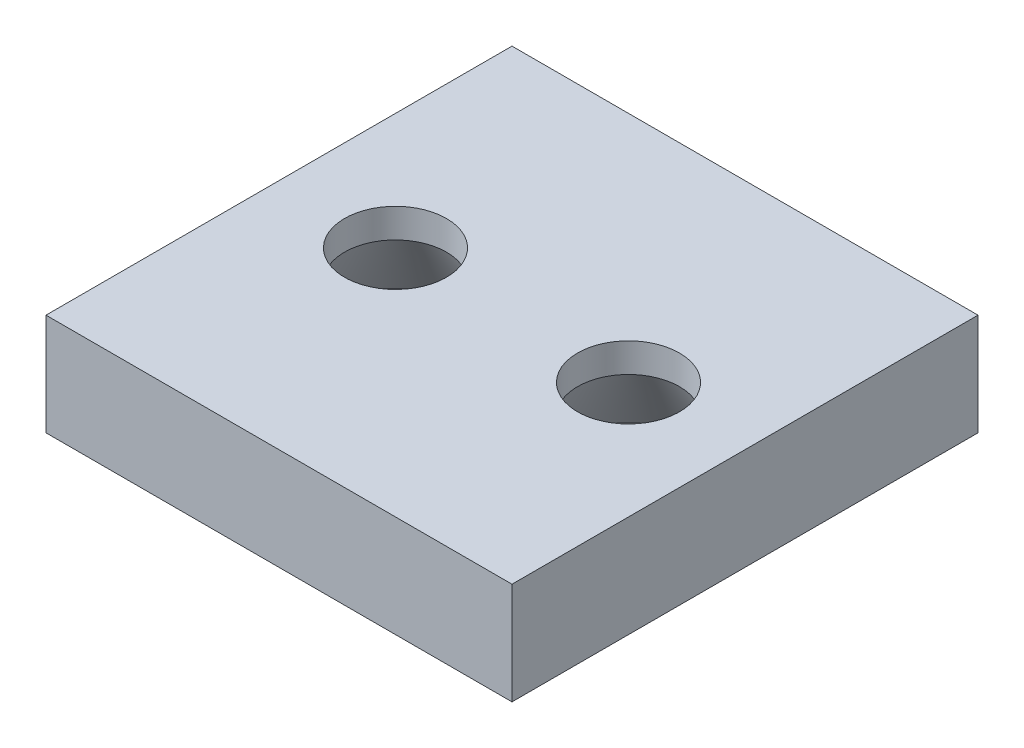
ISO-10303-21;
HEADER;
FILE_DESCRIPTION(('STEP AP214'),'2;1');
FILE_NAME('part.step','',(''),(''),'','','');
FILE_SCHEMA(('AUTOMOTIVE_DESIGN { 1 0 10303 214 1 1 1 1 }'));
ENDSEC;
DATA;
#1=APPLICATION_CONTEXT('core data for automotive mechanical design processes');
#2=APPLICATION_PROTOCOL_DEFINITION('international standard','automotive_design',2000,#1);
#3=PRODUCT_CONTEXT('',#1,'mechanical');
#4=PRODUCT('Part','Part','',(#3));
#5=PRODUCT_RELATED_PRODUCT_CATEGORY('part','',(#4));
#6=PRODUCT_DEFINITION_FORMATION('','',#4);
#7=PRODUCT_DEFINITION_CONTEXT('part definition',#1,'design');
#8=PRODUCT_DEFINITION('design','',#6,#7);
#9=PRODUCT_DEFINITION_SHAPE('','',#8);
#10=(LENGTH_UNIT() NAMED_UNIT(*) SI_UNIT(.MILLI.,.METRE.));
#11=(NAMED_UNIT(*) PLANE_ANGLE_UNIT() SI_UNIT($,.RADIAN.));
#12=(NAMED_UNIT(*) SI_UNIT($,.STERADIAN.) SOLID_ANGLE_UNIT());
#13=UNCERTAINTY_MEASURE_WITH_UNIT(LENGTH_MEASURE(1.E-05),#10,'distance_accuracy_value','');
#14=(GEOMETRIC_REPRESENTATION_CONTEXT(3) GLOBAL_UNCERTAINTY_ASSIGNED_CONTEXT((#13)) GLOBAL_UNIT_ASSIGNED_CONTEXT((#10,
#11,#12)) REPRESENTATION_CONTEXT('',''));
#15=CARTESIAN_POINT('',(0.,0.,0.));
#16=DIRECTION('',(0.,0.,1.));
#17=DIRECTION('',(1.,0.,0.));
#18=AXIS2_PLACEMENT_3D('',#15,#16,#17);
#19=CARTESIAN_POINT('',(16.,7.,-16.));
#20=DIRECTION('',(-1.,0.,0.));
#21=DIRECTION('',(0.,0.,1.));
#22=AXIS2_PLACEMENT_3D('',#19,#20,#21);
#23=PLANE('',#22);
#24=DIRECTION('',(0.,0.,-1.));
#25=VECTOR('',#24,1.);
#26=CARTESIAN_POINT('',(16.,0.,-16.));
#27=LINE('',#26,#25);
#28=CARTESIAN_POINT('',(16.,0.,16.));
#29=VERTEX_POINT('',#28);
#30=CARTESIAN_POINT('',(16.,0.,-16.));
#31=VERTEX_POINT('',#30);
#32=EDGE_CURVE('E99',#29,#31,#27,.T.);
#33=ORIENTED_EDGE('',*,*,#32,.T.);
#34=DIRECTION('',(0.,-1.,0.));
#35=VECTOR('',#34,1.);
#36=CARTESIAN_POINT('',(16.,7.,-16.));
#37=LINE('',#36,#35);
#38=CARTESIAN_POINT('',(16.,7.,-16.));
#39=VERTEX_POINT('',#38);
#40=EDGE_CURVE('E11',#39,#31,#37,.T.);
#41=ORIENTED_EDGE('',*,*,#40,.F.);
#42=DIRECTION('',(0.,0.,-1.));
#43=VECTOR('',#42,1.);
#44=CARTESIAN_POINT('',(16.,7.,-16.));
#45=LINE('',#44,#43);
#46=CARTESIAN_POINT('',(16.,7.,16.));
#47=VERTEX_POINT('',#46);
#48=EDGE_CURVE('E87',#47,#39,#45,.T.);
#49=ORIENTED_EDGE('',*,*,#48,.F.);
#50=DIRECTION('',(0.,-1.,0.));
#51=VECTOR('',#50,1.);
#52=CARTESIAN_POINT('',(16.,7.,16.));
#53=LINE('',#52,#51);
#54=EDGE_CURVE('E95',#47,#29,#53,.T.);
#55=ORIENTED_EDGE('',*,*,#54,.T.);
#56=EDGE_LOOP('',(#33,#41,#49,#55));
#57=FACE_BOUND('',#56,.T.);
#58=ADVANCED_FACE('F36',(#57),#23,.F.);
#59=CARTESIAN_POINT('',(-16.,7.,-16.));
#60=DIRECTION('',(0.,0.,1.));
#61=DIRECTION('',(1.,0.,0.));
#62=AXIS2_PLACEMENT_3D('',#59,#60,#61);
#63=PLANE('',#62);
#64=DIRECTION('',(-1.,0.,0.));
#65=VECTOR('',#64,1.);
#66=CARTESIAN_POINT('',(-16.,0.,-16.));
#67=LINE('',#66,#65);
#68=CARTESIAN_POINT('',(-16.,0.,-16.));
#69=VERTEX_POINT('',#68);
#70=EDGE_CURVE('E91',#31,#69,#67,.T.);
#71=ORIENTED_EDGE('',*,*,#70,.T.);
#72=DIRECTION('',(0.,-1.,0.));
#73=VECTOR('',#72,1.);
#74=CARTESIAN_POINT('',(-16.,7.,-16.));
#75=LINE('',#74,#73);
#76=CARTESIAN_POINT('',(-16.,7.,-16.));
#77=VERTEX_POINT('',#76);
#78=EDGE_CURVE('E44',#77,#69,#75,.T.);
#79=ORIENTED_EDGE('',*,*,#78,.F.);
#80=DIRECTION('',(-1.,0.,0.));
#81=VECTOR('',#80,1.);
#82=CARTESIAN_POINT('',(-16.,7.,-16.));
#83=LINE('',#82,#81);
#84=EDGE_CURVE('E82',#39,#77,#83,.T.);
#85=ORIENTED_EDGE('',*,*,#84,.F.);
#86=ORIENTED_EDGE('',*,*,#40,.T.);
#87=EDGE_LOOP('',(#71,#79,#85,#86));
#88=FACE_BOUND('',#87,.T.);
#89=ADVANCED_FACE('F90',(#88),#63,.F.);
#90=CARTESIAN_POINT('',(-16.,7.,-16.));
#91=DIRECTION('',(1.,0.,0.));
#92=DIRECTION('',(0.,0.,-1.));
#93=AXIS2_PLACEMENT_3D('',#90,#91,#92);
#94=PLANE('',#93);
#95=DIRECTION('',(0.,0.,1.));
#96=VECTOR('',#95,1.);
#97=CARTESIAN_POINT('',(-16.,0.,-16.));
#98=LINE('',#97,#96);
#99=CARTESIAN_POINT('',(-16.,0.,16.));
#100=VERTEX_POINT('',#99);
#101=EDGE_CURVE('E69',#69,#100,#98,.T.);
#102=ORIENTED_EDGE('',*,*,#101,.T.);
#103=DIRECTION('',(0.,-1.,0.));
#104=VECTOR('',#103,1.);
#105=CARTESIAN_POINT('',(-16.,7.,16.));
#106=LINE('',#105,#104);
#107=CARTESIAN_POINT('',(-16.,7.,16.));
#108=VERTEX_POINT('',#107);
#109=EDGE_CURVE('E92',#108,#100,#106,.T.);
#110=ORIENTED_EDGE('',*,*,#109,.F.);
#111=DIRECTION('',(0.,0.,1.));
#112=VECTOR('',#111,1.);
#113=CARTESIAN_POINT('',(-16.,7.,-16.));
#114=LINE('',#113,#112);
#115=EDGE_CURVE('E85',#77,#108,#114,.T.);
#116=ORIENTED_EDGE('',*,*,#115,.F.);
#117=ORIENTED_EDGE('',*,*,#78,.T.);
#118=EDGE_LOOP('',(#102,#110,#116,#117));
#119=FACE_BOUND('',#118,.T.);
#120=ADVANCED_FACE('F93',(#119),#94,.F.);
#121=CARTESIAN_POINT('',(-16.,7.,16.));
#122=DIRECTION('',(0.,0.,-1.));
#123=DIRECTION('',(-1.,0.,0.));
#124=AXIS2_PLACEMENT_3D('',#121,#122,#123);
#125=PLANE('',#124);
#126=DIRECTION('',(1.,0.,0.));
#127=VECTOR('',#126,1.);
#128=CARTESIAN_POINT('',(-16.,0.,16.));
#129=LINE('',#128,#127);
#130=EDGE_CURVE('E75',#100,#29,#129,.T.);
#131=ORIENTED_EDGE('',*,*,#130,.T.);
#132=ORIENTED_EDGE('',*,*,#54,.F.);
#133=DIRECTION('',(1.,0.,0.));
#134=VECTOR('',#133,1.);
#135=CARTESIAN_POINT('',(-16.,7.,16.));
#136=LINE('',#135,#134);
#137=EDGE_CURVE('E52',#108,#47,#136,.T.);
#138=ORIENTED_EDGE('',*,*,#137,.F.);
#139=ORIENTED_EDGE('',*,*,#109,.T.);
#140=EDGE_LOOP('',(#131,#132,#138,#139));
#141=FACE_BOUND('',#140,.T.);
#142=ADVANCED_FACE('F107',(#141),#125,.F.);
#143=CARTESIAN_POINT('',(0.,7.,0.));
#144=DIRECTION('',(0.,1.,0.));
#145=DIRECTION('',(0.,0.,1.));
#146=AXIS2_PLACEMENT_3D('',#143,#144,#145);
#147=PLANE('',#146);
#148=CARTESIAN_POINT('',(-7.99999999999999,7.,0.));
#149=DIRECTION('',(0.,-1.,0.));
#150=DIRECTION('',(0.,0.,-1.));
#151=AXIS2_PLACEMENT_3D('',#148,#149,#150);
#152=CIRCLE('',#151,3.5);
#153=CARTESIAN_POINT('',(-7.99999999999999,7.,-3.5));
#154=VERTEX_POINT('',#153);
#155=EDGE_CURVE('E121',#154,#154,#152,.T.);
#156=ORIENTED_EDGE('',*,*,#155,.T.);
#157=EDGE_LOOP('',(#156));
#158=FACE_BOUND('',#157,.T.);
#159=CARTESIAN_POINT('',(8.00000000000001,7.,0.));
#160=DIRECTION('',(0.,-1.,0.));
#161=DIRECTION('',(0.,0.,-1.));
#162=AXIS2_PLACEMENT_3D('',#159,#160,#161);
#163=CIRCLE('',#162,3.5);
#164=CARTESIAN_POINT('',(8.00000000000001,7.,-3.5));
#165=VERTEX_POINT('',#164);
#166=EDGE_CURVE('E102',#165,#165,#163,.T.);
#167=ORIENTED_EDGE('',*,*,#166,.T.);
#168=EDGE_LOOP('',(#167));
#169=FACE_BOUND('',#168,.T.);
#170=ORIENTED_EDGE('',*,*,#48,.T.);
#171=ORIENTED_EDGE('',*,*,#84,.T.);
#172=ORIENTED_EDGE('',*,*,#115,.T.);
#173=ORIENTED_EDGE('',*,*,#137,.T.);
#174=EDGE_LOOP('',(#170,#171,#172,#173));
#175=FACE_BOUND('',#174,.T.);
#176=ADVANCED_FACE('F83',(#158,#169,#175),#147,.T.);
#177=CARTESIAN_POINT('',(0.,0.,0.));
#178=DIRECTION('',(0.,1.,0.));
#179=DIRECTION('',(0.,0.,1.));
#180=AXIS2_PLACEMENT_3D('',#177,#178,#179);
#181=PLANE('',#180);
#182=CARTESIAN_POINT('',(-7.99999999999999,0.,0.));
#183=DIRECTION('',(0.,-1.,0.));
#184=DIRECTION('',(0.,0.,-1.));
#185=AXIS2_PLACEMENT_3D('',#182,#183,#184);
#186=CIRCLE('',#185,6.5);
#187=CARTESIAN_POINT('',(-7.99999999999999,0.,-6.5));
#188=VERTEX_POINT('',#187);
#189=EDGE_CURVE('E127',#188,#188,#186,.T.);
#190=ORIENTED_EDGE('',*,*,#189,.F.);
#191=EDGE_LOOP('',(#190));
#192=FACE_BOUND('',#191,.T.);
#193=CARTESIAN_POINT('',(8.00000000000001,0.,0.));
#194=DIRECTION('',(0.,-1.,0.));
#195=DIRECTION('',(0.,0.,-1.));
#196=AXIS2_PLACEMENT_3D('',#193,#194,#195);
#197=CIRCLE('',#196,6.5);
#198=CARTESIAN_POINT('',(8.00000000000001,0.,-6.5));
#199=VERTEX_POINT('',#198);
#200=EDGE_CURVE('E118',#199,#199,#197,.T.);
#201=ORIENTED_EDGE('',*,*,#200,.F.);
#202=EDGE_LOOP('',(#201));
#203=FACE_BOUND('',#202,.T.);
#204=ORIENTED_EDGE('',*,*,#32,.F.);
#205=ORIENTED_EDGE('',*,*,#130,.F.);
#206=ORIENTED_EDGE('',*,*,#101,.F.);
#207=ORIENTED_EDGE('',*,*,#70,.F.);
#208=EDGE_LOOP('',(#204,#205,#206,#207));
#209=FACE_BOUND('',#208,.T.);
#210=ADVANCED_FACE('F110',(#192,#203,#209),#181,.F.);
#211=CARTESIAN_POINT('',(8.00000000000001,0.,0.));
#212=DIRECTION('',(0.,-1.,0.));
#213=DIRECTION('',(0.,0.,-1.));
#214=AXIS2_PLACEMENT_3D('',#211,#212,#213);
#215=CYLINDRICAL_SURFACE('',#214,3.5);
#216=ORIENTED_EDGE('',*,*,#166,.F.);
#217=EDGE_LOOP('',(#216));
#218=FACE_BOUND('',#217,.T.);
#219=CARTESIAN_POINT('',(8.00000000000001,4.99975404598915,0.));
#220=DIRECTION('',(0.,-1.,0.));
#221=DIRECTION('',(0.,0.,-1.));
#222=AXIS2_PLACEMENT_3D('',#219,#220,#221);
#223=CIRCLE('',#222,3.5);
#224=CARTESIAN_POINT('',(8.00000000000001,4.99975404598915,-3.5));
#225=VERTEX_POINT('',#224);
#226=EDGE_CURVE('E115',#225,#225,#223,.T.);
#227=ORIENTED_EDGE('',*,*,#226,.T.);
#228=EDGE_LOOP('',(#227));
#229=FACE_BOUND('',#228,.T.);
#230=ADVANCED_FACE('F135',(#218,#229),#215,.F.);
#231=CARTESIAN_POINT('',(8.00000000000001,0.,0.));
#232=DIRECTION('',(0.,-1.,0.));
#233=DIRECTION('',(0.,0.,-1.));
#234=AXIS2_PLACEMENT_3D('',#231,#232,#233);
#235=CONICAL_SURFACE('',#234,6.5,0.540441202880045);
#236=ORIENTED_EDGE('',*,*,#226,.F.);
#237=EDGE_LOOP('',(#236));
#238=FACE_BOUND('',#237,.T.);
#239=ORIENTED_EDGE('',*,*,#200,.T.);
#240=EDGE_LOOP('',(#239));
#241=FACE_BOUND('',#240,.T.);
#242=ADVANCED_FACE('F139',(#238,#241),#235,.F.);
#243=CARTESIAN_POINT('',(-7.99999999999999,0.,0.));
#244=DIRECTION('',(0.,-1.,0.));
#245=DIRECTION('',(0.,0.,-1.));
#246=AXIS2_PLACEMENT_3D('',#243,#244,#245);
#247=CYLINDRICAL_SURFACE('',#246,3.5);
#248=ORIENTED_EDGE('',*,*,#155,.F.);
#249=EDGE_LOOP('',(#248));
#250=FACE_BOUND('',#249,.T.);
#251=CARTESIAN_POINT('',(-7.99999999999999,4.99975404598915,0.));
#252=DIRECTION('',(0.,-1.,0.));
#253=DIRECTION('',(0.,0.,-1.));
#254=AXIS2_PLACEMENT_3D('',#251,#252,#253);
#255=CIRCLE('',#254,3.5);
#256=CARTESIAN_POINT('',(-7.99999999999999,4.99975404598915,-3.5));
#257=VERTEX_POINT('',#256);
#258=EDGE_CURVE('E124',#257,#257,#255,.T.);
#259=ORIENTED_EDGE('',*,*,#258,.T.);
#260=EDGE_LOOP('',(#259));
#261=FACE_BOUND('',#260,.T.);
#262=ADVANCED_FACE('F141',(#250,#261),#247,.F.);
#263=CARTESIAN_POINT('',(-7.99999999999999,0.,0.));
#264=DIRECTION('',(0.,-1.,0.));
#265=DIRECTION('',(0.,0.,-1.));
#266=AXIS2_PLACEMENT_3D('',#263,#264,#265);
#267=CONICAL_SURFACE('',#266,6.5,0.540441202880045);
#268=ORIENTED_EDGE('',*,*,#258,.F.);
#269=EDGE_LOOP('',(#268));
#270=FACE_BOUND('',#269,.T.);
#271=ORIENTED_EDGE('',*,*,#189,.T.);
#272=EDGE_LOOP('',(#271));
#273=FACE_BOUND('',#272,.T.);
#274=ADVANCED_FACE('F131',(#270,#273),#267,.F.);
#275=CLOSED_SHELL('',(#58,#89,#120,#142,#176,#210,#230,#242,#262,#274));
#276=MANIFOLD_SOLID_BREP('B2',#275);
#277=ADVANCED_BREP_SHAPE_REPRESENTATION('',(#18,#276),#14);
#278=SHAPE_DEFINITION_REPRESENTATION(#9,#277);
ENDSEC;
END-ISO-10303-21;
